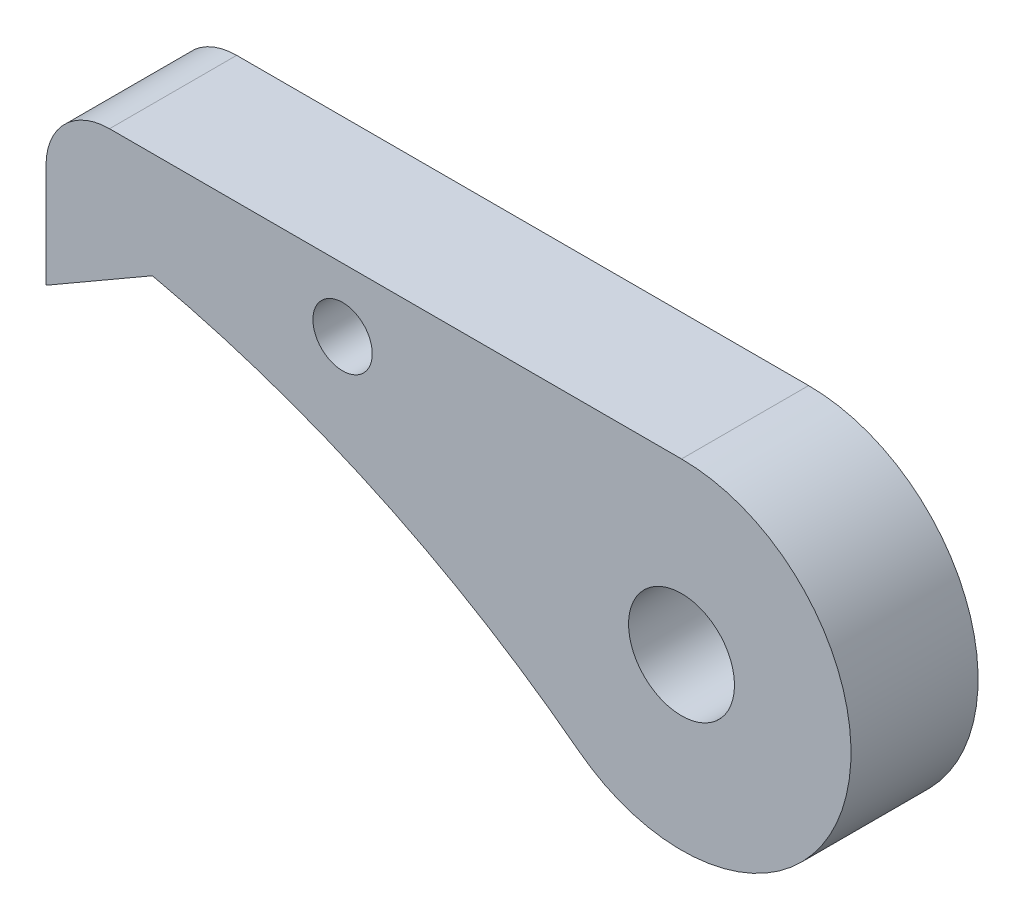
ISO-10303-21;
HEADER;
FILE_DESCRIPTION(('STEP AP214'),'2;1');
FILE_NAME('part.step','',(''),(''),'','','');
FILE_SCHEMA(('AUTOMOTIVE_DESIGN { 1 0 10303 214 1 1 1 1 }'));
ENDSEC;
DATA;
#1=APPLICATION_CONTEXT('core data for automotive mechanical design processes');
#2=APPLICATION_PROTOCOL_DEFINITION('international standard','automotive_design',2000,#1);
#3=PRODUCT_CONTEXT('',#1,'mechanical');
#4=PRODUCT('Part','Part','',(#3));
#5=PRODUCT_RELATED_PRODUCT_CATEGORY('part','',(#4));
#6=PRODUCT_DEFINITION_FORMATION('','',#4);
#7=PRODUCT_DEFINITION_CONTEXT('part definition',#1,'design');
#8=PRODUCT_DEFINITION('design','',#6,#7);
#9=PRODUCT_DEFINITION_SHAPE('','',#8);
#10=(LENGTH_UNIT() NAMED_UNIT(*) SI_UNIT(.MILLI.,.METRE.));
#11=(NAMED_UNIT(*) PLANE_ANGLE_UNIT() SI_UNIT($,.RADIAN.));
#12=(NAMED_UNIT(*) SI_UNIT($,.STERADIAN.) SOLID_ANGLE_UNIT());
#13=UNCERTAINTY_MEASURE_WITH_UNIT(LENGTH_MEASURE(1.E-05),#10,'distance_accuracy_value','');
#14=(GEOMETRIC_REPRESENTATION_CONTEXT(3) GLOBAL_UNCERTAINTY_ASSIGNED_CONTEXT((#13)) GLOBAL_UNIT_ASSIGNED_CONTEXT((#10,
#11,#12)) REPRESENTATION_CONTEXT('',''));
#15=CARTESIAN_POINT('',(0.,0.,0.));
#16=DIRECTION('',(0.,0.,1.));
#17=DIRECTION('',(1.,0.,0.));
#18=AXIS2_PLACEMENT_3D('',#15,#16,#17);
#19=CARTESIAN_POINT('',(-27.,5.,3.));
#20=DIRECTION('',(0.,0.,1.));
#21=DIRECTION('',(1.,0.,0.));
#22=AXIS2_PLACEMENT_3D('',#19,#20,#21);
#23=PLANE('',#22);
#24=CARTESIAN_POINT('',(-16.,5.,3.));
#25=DIRECTION('',(0.,0.,1.));
#26=DIRECTION('',(1.,0.,0.));
#27=AXIS2_PLACEMENT_3D('',#24,#25,#26);
#28=CIRCLE('',#27,1.4);
#29=CARTESIAN_POINT('',(-14.6,5.,3.));
#30=VERTEX_POINT('',#29);
#31=EDGE_CURVE('E179',#30,#30,#28,.T.);
#32=ORIENTED_EDGE('',*,*,#31,.F.);
#33=EDGE_LOOP('',(#32));
#34=FACE_BOUND('',#33,.T.);
#35=CARTESIAN_POINT('',(-27.,5.,3.));
#36=DIRECTION('',(0.,0.,1.));
#37=DIRECTION('',(1.,0.,0.));
#38=AXIS2_PLACEMENT_3D('',#35,#36,#37);
#39=CIRCLE('',#38,3.);
#40=CARTESIAN_POINT('',(-27.,8.,3.));
#41=VERTEX_POINT('',#40);
#42=CARTESIAN_POINT('',(-30.,5.,3.));
#43=VERTEX_POINT('',#42);
#44=EDGE_CURVE('E136',#41,#43,#39,.T.);
#45=ORIENTED_EDGE('',*,*,#44,.T.);
#46=DIRECTION('',(0.,-1.,0.));
#47=VECTOR('',#46,1.);
#48=CARTESIAN_POINT('',(-30.,5.,3.));
#49=LINE('',#48,#47);
#50=CARTESIAN_POINT('',(-30.,0.0999999999999957,3.));
#51=VERTEX_POINT('',#50);
#52=EDGE_CURVE('E94',#43,#51,#49,.T.);
#53=ORIENTED_EDGE('',*,*,#52,.T.);
#54=DIRECTION('',(0.866025403784436,0.500000000000005,0.));
#55=VECTOR('',#54,1.);
#56=CARTESIAN_POINT('',(-30.,0.0999999999999957,3.));
#57=LINE('',#56,#55);
#58=CARTESIAN_POINT('',(-24.9770526580503,2.99999999999999,3.));
#59=VERTEX_POINT('',#58);
#60=EDGE_CURVE('E107',#51,#59,#57,.T.);
#61=ORIENTED_EDGE('',*,*,#60,.T.);
#62=CARTESIAN_POINT('',(-36.1859332539834,-47.4129862210553,3.));
#63=DIRECTION('',(0.,0.,-1.));
#64=DIRECTION('',(-1.,0.,0.));
#65=AXIS2_PLACEMENT_3D('',#62,#63,#64);
#66=CIRCLE('',#65,51.6440527450954);
#67=CARTESIAN_POINT('',(-4.85358477012065,-6.35945869388685,3.));
#68=VERTEX_POINT('',#67);
#69=EDGE_CURVE('E101',#59,#68,#66,.T.);
#70=ORIENTED_EDGE('',*,*,#69,.T.);
#71=CARTESIAN_POINT('',(0.,0.,3.));
#72=DIRECTION('',(0.,0.,1.));
#73=DIRECTION('',(1.,0.,0.));
#74=AXIS2_PLACEMENT_3D('',#71,#72,#73);
#75=CIRCLE('',#74,8.00000000000001);
#76=CARTESIAN_POINT('',(0.,8.,3.));
#77=VERTEX_POINT('',#76);
#78=EDGE_CURVE('E105',#68,#77,#75,.T.);
#79=ORIENTED_EDGE('',*,*,#78,.T.);
#80=DIRECTION('',(-1.,0.,0.));
#81=VECTOR('',#80,1.);
#82=CARTESIAN_POINT('',(0.,8.,3.));
#83=LINE('',#82,#81);
#84=EDGE_CURVE('E57',#77,#41,#83,.T.);
#85=ORIENTED_EDGE('',*,*,#84,.T.);
#86=EDGE_LOOP('',(#45,#53,#61,#70,#79,#85));
#87=FACE_BOUND('',#86,.T.);
#88=CARTESIAN_POINT('',(0.,0.,3.));
#89=DIRECTION('',(0.,0.,1.));
#90=DIRECTION('',(1.,0.,0.));
#91=AXIS2_PLACEMENT_3D('',#88,#89,#90);
#92=CIRCLE('',#91,2.5);
#93=CARTESIAN_POINT('',(2.5,0.,3.));
#94=VERTEX_POINT('',#93);
#95=EDGE_CURVE('E129',#94,#94,#92,.T.);
#96=ORIENTED_EDGE('',*,*,#95,.F.);
#97=EDGE_LOOP('',(#96));
#98=FACE_BOUND('',#97,.T.);
#99=ADVANCED_FACE('F39',(#34,#87,#98),#23,.T.);
#100=CARTESIAN_POINT('',(-27.,5.,-3.));
#101=DIRECTION('',(0.,0.,1.));
#102=DIRECTION('',(1.,0.,0.));
#103=AXIS2_PLACEMENT_3D('',#100,#101,#102);
#104=PLANE('',#103);
#105=CARTESIAN_POINT('',(-16.,5.,-3.));
#106=DIRECTION('',(0.,0.,1.));
#107=DIRECTION('',(1.,0.,0.));
#108=AXIS2_PLACEMENT_3D('',#105,#106,#107);
#109=CIRCLE('',#108,1.4);
#110=CARTESIAN_POINT('',(-14.6,5.,-3.));
#111=VERTEX_POINT('',#110);
#112=EDGE_CURVE('E43',#111,#111,#109,.T.);
#113=ORIENTED_EDGE('',*,*,#112,.T.);
#114=EDGE_LOOP('',(#113));
#115=FACE_BOUND('',#114,.T.);
#116=CARTESIAN_POINT('',(-27.,5.,-3.));
#117=DIRECTION('',(0.,0.,1.));
#118=DIRECTION('',(1.,0.,0.));
#119=AXIS2_PLACEMENT_3D('',#116,#117,#118);
#120=CIRCLE('',#119,3.);
#121=CARTESIAN_POINT('',(-27.,8.,-3.));
#122=VERTEX_POINT('',#121);
#123=CARTESIAN_POINT('',(-30.,5.,-3.));
#124=VERTEX_POINT('',#123);
#125=EDGE_CURVE('E125',#122,#124,#120,.T.);
#126=ORIENTED_EDGE('',*,*,#125,.F.);
#127=DIRECTION('',(-1.,0.,0.));
#128=VECTOR('',#127,1.);
#129=CARTESIAN_POINT('',(0.,8.,-3.));
#130=LINE('',#129,#128);
#131=CARTESIAN_POINT('',(0.,8.,-3.));
#132=VERTEX_POINT('',#131);
#133=EDGE_CURVE('E86',#132,#122,#130,.T.);
#134=ORIENTED_EDGE('',*,*,#133,.F.);
#135=CARTESIAN_POINT('',(0.,0.,-3.));
#136=DIRECTION('',(0.,0.,1.));
#137=DIRECTION('',(1.,0.,0.));
#138=AXIS2_PLACEMENT_3D('',#135,#136,#137);
#139=CIRCLE('',#138,8.00000000000001);
#140=CARTESIAN_POINT('',(-4.85358477012065,-6.35945869388685,-3.));
#141=VERTEX_POINT('',#140);
#142=EDGE_CURVE('E80',#141,#132,#139,.T.);
#143=ORIENTED_EDGE('',*,*,#142,.F.);
#144=CARTESIAN_POINT('',(-36.1859332539834,-47.4129862210553,-3.));
#145=DIRECTION('',(0.,0.,-1.));
#146=DIRECTION('',(-1.,0.,0.));
#147=AXIS2_PLACEMENT_3D('',#144,#145,#146);
#148=CIRCLE('',#147,51.6440527450954);
#149=CARTESIAN_POINT('',(-24.9770526580503,2.99999999999999,-3.));
#150=VERTEX_POINT('',#149);
#151=EDGE_CURVE('E115',#150,#141,#148,.T.);
#152=ORIENTED_EDGE('',*,*,#151,.F.);
#153=DIRECTION('',(0.866025403784436,0.500000000000005,0.));
#154=VECTOR('',#153,1.);
#155=CARTESIAN_POINT('',(-30.,0.0999999999999957,-3.));
#156=LINE('',#155,#154);
#157=CARTESIAN_POINT('',(-30.,0.0999999999999957,-3.));
#158=VERTEX_POINT('',#157);
#159=EDGE_CURVE('E131',#158,#150,#156,.T.);
#160=ORIENTED_EDGE('',*,*,#159,.F.);
#161=DIRECTION('',(0.,-1.,0.));
#162=VECTOR('',#161,1.);
#163=CARTESIAN_POINT('',(-30.,5.,-3.));
#164=LINE('',#163,#162);
#165=EDGE_CURVE('E128',#124,#158,#164,.T.);
#166=ORIENTED_EDGE('',*,*,#165,.F.);
#167=EDGE_LOOP('',(#126,#134,#143,#152,#160,#166));
#168=FACE_BOUND('',#167,.T.);
#169=CARTESIAN_POINT('',(0.,0.,-3.));
#170=DIRECTION('',(0.,0.,1.));
#171=DIRECTION('',(1.,0.,0.));
#172=AXIS2_PLACEMENT_3D('',#169,#170,#171);
#173=CIRCLE('',#172,2.5);
#174=CARTESIAN_POINT('',(2.5,0.,-3.));
#175=VERTEX_POINT('',#174);
#176=EDGE_CURVE('E182',#175,#175,#173,.T.);
#177=ORIENTED_EDGE('',*,*,#176,.T.);
#178=EDGE_LOOP('',(#177));
#179=FACE_BOUND('',#178,.T.);
#180=ADVANCED_FACE('F146',(#115,#168,#179),#104,.F.);
#181=CARTESIAN_POINT('',(-27.,5.,3.));
#182=DIRECTION('',(0.,0.,-1.));
#183=DIRECTION('',(-1.,0.,0.));
#184=AXIS2_PLACEMENT_3D('',#181,#182,#183);
#185=CYLINDRICAL_SURFACE('',#184,3.);
#186=ORIENTED_EDGE('',*,*,#125,.T.);
#187=DIRECTION('',(0.,0.,-1.));
#188=VECTOR('',#187,1.);
#189=CARTESIAN_POINT('',(-30.,5.,3.));
#190=LINE('',#189,#188);
#191=EDGE_CURVE('E11',#43,#124,#190,.T.);
#192=ORIENTED_EDGE('',*,*,#191,.F.);
#193=ORIENTED_EDGE('',*,*,#44,.F.);
#194=DIRECTION('',(0.,0.,-1.));
#195=VECTOR('',#194,1.);
#196=CARTESIAN_POINT('',(-27.,8.,3.));
#197=LINE('',#196,#195);
#198=EDGE_CURVE('E121',#41,#122,#197,.T.);
#199=ORIENTED_EDGE('',*,*,#198,.T.);
#200=EDGE_LOOP('',(#186,#192,#193,#199));
#201=FACE_BOUND('',#200,.T.);
#202=ADVANCED_FACE('F41',(#201),#185,.T.);
#203=CARTESIAN_POINT('',(-30.,5.,3.));
#204=DIRECTION('',(1.,0.,0.));
#205=DIRECTION('',(0.,0.,-1.));
#206=AXIS2_PLACEMENT_3D('',#203,#204,#205);
#207=PLANE('',#206);
#208=ORIENTED_EDGE('',*,*,#165,.T.);
#209=DIRECTION('',(0.,0.,-1.));
#210=VECTOR('',#209,1.);
#211=CARTESIAN_POINT('',(-30.,0.0999999999999957,3.));
#212=LINE('',#211,#210);
#213=EDGE_CURVE('E49',#51,#158,#212,.T.);
#214=ORIENTED_EDGE('',*,*,#213,.F.);
#215=ORIENTED_EDGE('',*,*,#52,.F.);
#216=ORIENTED_EDGE('',*,*,#191,.T.);
#217=EDGE_LOOP('',(#208,#214,#215,#216));
#218=FACE_BOUND('',#217,.T.);
#219=ADVANCED_FACE('F219',(#218),#207,.F.);
#220=CARTESIAN_POINT('',(-30.,0.0999999999999957,3.));
#221=DIRECTION('',(-0.500000000000005,0.866025403784436,0.));
#222=DIRECTION('',(-0.866025403784436,-0.500000000000005,0.));
#223=AXIS2_PLACEMENT_3D('',#220,#221,#222);
#224=PLANE('',#223);
#225=ORIENTED_EDGE('',*,*,#159,.T.);
#226=DIRECTION('',(0.,0.,-1.));
#227=VECTOR('',#226,1.);
#228=CARTESIAN_POINT('',(-24.9770526580503,2.99999999999999,3.));
#229=LINE('',#228,#227);
#230=EDGE_CURVE('E116',#59,#150,#229,.T.);
#231=ORIENTED_EDGE('',*,*,#230,.F.);
#232=ORIENTED_EDGE('',*,*,#60,.F.);
#233=ORIENTED_EDGE('',*,*,#213,.T.);
#234=EDGE_LOOP('',(#225,#231,#232,#233));
#235=FACE_BOUND('',#234,.T.);
#236=ADVANCED_FACE('F143',(#235),#224,.F.);
#237=CARTESIAN_POINT('',(-36.1859332539834,-47.4129862210553,3.));
#238=DIRECTION('',(0.,0.,-1.));
#239=DIRECTION('',(-1.,0.,0.));
#240=AXIS2_PLACEMENT_3D('',#237,#238,#239);
#241=CYLINDRICAL_SURFACE('',#240,51.6440527450954);
#242=ORIENTED_EDGE('',*,*,#151,.T.);
#243=DIRECTION('',(0.,0.,-1.));
#244=VECTOR('',#243,1.);
#245=CARTESIAN_POINT('',(-4.85358477012065,-6.35945869388685,3.));
#246=LINE('',#245,#244);
#247=EDGE_CURVE('E112',#68,#141,#246,.T.);
#248=ORIENTED_EDGE('',*,*,#247,.F.);
#249=ORIENTED_EDGE('',*,*,#69,.F.);
#250=ORIENTED_EDGE('',*,*,#230,.T.);
#251=EDGE_LOOP('',(#242,#248,#249,#250));
#252=FACE_BOUND('',#251,.T.);
#253=ADVANCED_FACE('F113',(#252),#241,.F.);
#254=CARTESIAN_POINT('',(0.,0.,3.));
#255=DIRECTION('',(0.,0.,-1.));
#256=DIRECTION('',(-1.,0.,0.));
#257=AXIS2_PLACEMENT_3D('',#254,#255,#256);
#258=CYLINDRICAL_SURFACE('',#257,8.00000000000001);
#259=ORIENTED_EDGE('',*,*,#142,.T.);
#260=DIRECTION('',(0.,0.,-1.));
#261=VECTOR('',#260,1.);
#262=CARTESIAN_POINT('',(0.,8.,3.));
#263=LINE('',#262,#261);
#264=EDGE_CURVE('E117',#77,#132,#263,.T.);
#265=ORIENTED_EDGE('',*,*,#264,.F.);
#266=ORIENTED_EDGE('',*,*,#78,.F.);
#267=ORIENTED_EDGE('',*,*,#247,.T.);
#268=EDGE_LOOP('',(#259,#265,#266,#267));
#269=FACE_BOUND('',#268,.T.);
#270=ADVANCED_FACE('F119',(#269),#258,.T.);
#271=CARTESIAN_POINT('',(0.,8.,3.));
#272=DIRECTION('',(0.,-1.,0.));
#273=DIRECTION('',(1.,0.,0.));
#274=AXIS2_PLACEMENT_3D('',#271,#272,#273);
#275=PLANE('',#274);
#276=ORIENTED_EDGE('',*,*,#133,.T.);
#277=ORIENTED_EDGE('',*,*,#198,.F.);
#278=ORIENTED_EDGE('',*,*,#84,.F.);
#279=ORIENTED_EDGE('',*,*,#264,.T.);
#280=EDGE_LOOP('',(#276,#277,#278,#279));
#281=FACE_BOUND('',#280,.T.);
#282=ADVANCED_FACE('F151',(#281),#275,.F.);
#283=CARTESIAN_POINT('',(0.,0.,3.));
#284=DIRECTION('',(0.,0.,-1.));
#285=DIRECTION('',(-1.,0.,0.));
#286=AXIS2_PLACEMENT_3D('',#283,#284,#285);
#287=CYLINDRICAL_SURFACE('',#286,2.5);
#288=ORIENTED_EDGE('',*,*,#95,.T.);
#289=EDGE_LOOP('',(#288));
#290=FACE_BOUND('',#289,.T.);
#291=ORIENTED_EDGE('',*,*,#176,.F.);
#292=EDGE_LOOP('',(#291));
#293=FACE_BOUND('',#292,.T.);
#294=ADVANCED_FACE('F153',(#290,#293),#287,.F.);
#295=CARTESIAN_POINT('',(-16.,5.,-7.));
#296=DIRECTION('',(0.,0.,1.));
#297=DIRECTION('',(1.,0.,0.));
#298=AXIS2_PLACEMENT_3D('',#295,#296,#297);
#299=CYLINDRICAL_SURFACE('',#298,1.4);
#300=ORIENTED_EDGE('',*,*,#31,.T.);
#301=EDGE_LOOP('',(#300));
#302=FACE_BOUND('',#301,.T.);
#303=ORIENTED_EDGE('',*,*,#112,.F.);
#304=EDGE_LOOP('',(#303));
#305=FACE_BOUND('',#304,.T.);
#306=ADVANCED_FACE('F159',(#302,#305),#299,.F.);
#307=CLOSED_SHELL('',(#99,#180,#202,#219,#236,#253,#270,#282,#294,#306));
#308=MANIFOLD_SOLID_BREP('B2',#307);
#309=ADVANCED_BREP_SHAPE_REPRESENTATION('',(#18,#308),#14);
#310=SHAPE_DEFINITION_REPRESENTATION(#9,#309);
ENDSEC;
END-ISO-10303-21;
